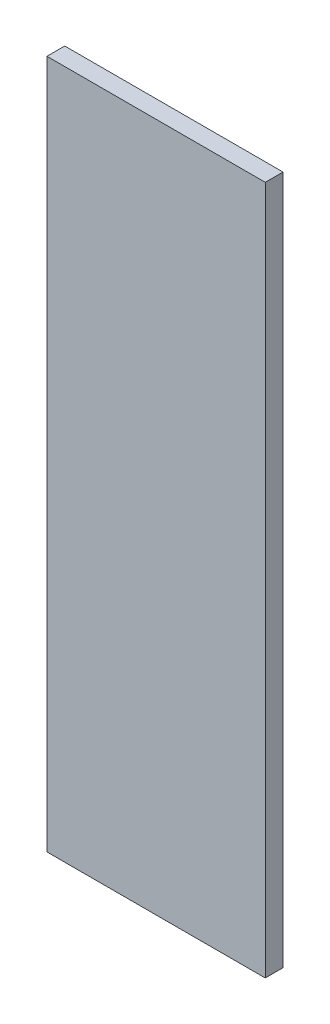
ISO-10303-21;
HEADER;
FILE_DESCRIPTION(('STEP AP214'),'2;1');
FILE_NAME('part.step','',(''),(''),'','','');
FILE_SCHEMA(('AUTOMOTIVE_DESIGN { 1 0 10303 214 1 1 1 1 }'));
ENDSEC;
DATA;
#1=APPLICATION_CONTEXT('core data for automotive mechanical design processes');
#2=APPLICATION_PROTOCOL_DEFINITION('international standard','automotive_design',2000,#1);
#3=PRODUCT_CONTEXT('',#1,'mechanical');
#4=PRODUCT('Part','Part','',(#3));
#5=PRODUCT_RELATED_PRODUCT_CATEGORY('part','',(#4));
#6=PRODUCT_DEFINITION_FORMATION('','',#4);
#7=PRODUCT_DEFINITION_CONTEXT('part definition',#1,'design');
#8=PRODUCT_DEFINITION('design','',#6,#7);
#9=PRODUCT_DEFINITION_SHAPE('','',#8);
#10=(LENGTH_UNIT() NAMED_UNIT(*) SI_UNIT(.MILLI.,.METRE.));
#11=(NAMED_UNIT(*) PLANE_ANGLE_UNIT() SI_UNIT($,.RADIAN.));
#12=(NAMED_UNIT(*) SI_UNIT($,.STERADIAN.) SOLID_ANGLE_UNIT());
#13=UNCERTAINTY_MEASURE_WITH_UNIT(LENGTH_MEASURE(1.E-05),#10,'distance_accuracy_value','');
#14=(GEOMETRIC_REPRESENTATION_CONTEXT(3) GLOBAL_UNCERTAINTY_ASSIGNED_CONTEXT((#13)) GLOBAL_UNIT_ASSIGNED_CONTEXT((#10,
#11,#12)) REPRESENTATION_CONTEXT('',''));
#15=CARTESIAN_POINT('',(0.,0.,0.));
#16=DIRECTION('',(0.,0.,1.));
#17=DIRECTION('',(1.,0.,0.));
#18=AXIS2_PLACEMENT_3D('',#15,#16,#17);
#19=CARTESIAN_POINT('',(0.67499992,-2.13058502,0.));
#20=DIRECTION('',(-1.,0.,0.));
#21=DIRECTION('',(0.,1.,0.));
#22=AXIS2_PLACEMENT_3D('',#19,#20,#21);
#23=PLANE('',#22);
#24=DIRECTION('',(0.,1.,0.));
#25=VECTOR('',#24,1.);
#26=CARTESIAN_POINT('',(0.67499992,-2.13058502,0.));
#27=LINE('',#26,#25);
#28=CARTESIAN_POINT('',(0.67499992,-2.13058502,0.));
#29=VERTEX_POINT('',#28);
#30=CARTESIAN_POINT('',(0.67499992,2.13058502,0.));
#31=VERTEX_POINT('',#30);
#32=EDGE_CURVE('E11',#29,#31,#27,.T.);
#33=ORIENTED_EDGE('',*,*,#32,.T.);
#34=DIRECTION('',(0.,0.,1.));
#35=VECTOR('',#34,1.);
#36=CARTESIAN_POINT('',(0.67499992,2.13058502,0.));
#37=LINE('',#36,#35);
#38=CARTESIAN_POINT('',(0.67499992,2.13058502,0.10999978));
#39=VERTEX_POINT('',#38);
#40=EDGE_CURVE('E24',#31,#39,#37,.T.);
#41=ORIENTED_EDGE('',*,*,#40,.T.);
#42=DIRECTION('',(0.,1.,0.));
#43=VECTOR('',#42,1.);
#44=CARTESIAN_POINT('',(0.67499992,-2.13058502,0.10999978));
#45=LINE('',#44,#43);
#46=CARTESIAN_POINT('',(0.67499992,-2.13058502,0.10999978));
#47=VERTEX_POINT('',#46);
#48=EDGE_CURVE('E87',#47,#39,#45,.T.);
#49=ORIENTED_EDGE('',*,*,#48,.F.);
#50=DIRECTION('',(0.,0.,1.));
#51=VECTOR('',#50,1.);
#52=CARTESIAN_POINT('',(0.67499992,-2.13058502,0.));
#53=LINE('',#52,#51);
#54=EDGE_CURVE('E36',#29,#47,#53,.T.);
#55=ORIENTED_EDGE('',*,*,#54,.F.);
#56=EDGE_LOOP('',(#33,#41,#49,#55));
#57=FACE_BOUND('',#56,.T.);
#58=ADVANCED_FACE('F17',(#57),#23,.F.);
#59=CARTESIAN_POINT('',(0.67499992,2.13058502,0.));
#60=DIRECTION('',(0.,-1.,0.));
#61=DIRECTION('',(-1.,0.,0.));
#62=AXIS2_PLACEMENT_3D('',#59,#60,#61);
#63=PLANE('',#62);
#64=DIRECTION('',(-1.,0.,0.));
#65=VECTOR('',#64,1.);
#66=CARTESIAN_POINT('',(0.67499992,2.13058502,0.));
#67=LINE('',#66,#65);
#68=CARTESIAN_POINT('',(-0.67499992,2.13058502,0.));
#69=VERTEX_POINT('',#68);
#70=EDGE_CURVE('E84',#31,#69,#67,.T.);
#71=ORIENTED_EDGE('',*,*,#70,.T.);
#72=DIRECTION('',(0.,0.,1.));
#73=VECTOR('',#72,1.);
#74=CARTESIAN_POINT('',(-0.67499992,2.13058502,0.));
#75=LINE('',#74,#73);
#76=CARTESIAN_POINT('',(-0.67499992,2.13058502,0.10999978));
#77=VERTEX_POINT('',#76);
#78=EDGE_CURVE('E82',#69,#77,#75,.T.);
#79=ORIENTED_EDGE('',*,*,#78,.T.);
#80=DIRECTION('',(-1.,0.,0.));
#81=VECTOR('',#80,1.);
#82=CARTESIAN_POINT('',(0.67499992,2.13058502,0.10999978));
#83=LINE('',#82,#81);
#84=EDGE_CURVE('E62',#39,#77,#83,.T.);
#85=ORIENTED_EDGE('',*,*,#84,.F.);
#86=ORIENTED_EDGE('',*,*,#40,.F.);
#87=EDGE_LOOP('',(#71,#79,#85,#86));
#88=FACE_BOUND('',#87,.T.);
#89=ADVANCED_FACE('F89',(#88),#63,.F.);
#90=CARTESIAN_POINT('',(-0.67499992,2.13058502,0.));
#91=DIRECTION('',(1.,0.,0.));
#92=DIRECTION('',(0.,-1.,0.));
#93=AXIS2_PLACEMENT_3D('',#90,#91,#92);
#94=PLANE('',#93);
#95=DIRECTION('',(0.,-1.,0.));
#96=VECTOR('',#95,1.);
#97=CARTESIAN_POINT('',(-0.67499992,2.13058502,0.));
#98=LINE('',#97,#96);
#99=CARTESIAN_POINT('',(-0.67499992,-2.13058502,0.));
#100=VERTEX_POINT('',#99);
#101=EDGE_CURVE('E71',#69,#100,#98,.T.);
#102=ORIENTED_EDGE('',*,*,#101,.T.);
#103=DIRECTION('',(0.,0.,1.));
#104=VECTOR('',#103,1.);
#105=CARTESIAN_POINT('',(-0.67499992,-2.13058502,0.));
#106=LINE('',#105,#104);
#107=CARTESIAN_POINT('',(-0.67499992,-2.13058502,0.10999978));
#108=VERTEX_POINT('',#107);
#109=EDGE_CURVE('E65',#100,#108,#106,.T.);
#110=ORIENTED_EDGE('',*,*,#109,.T.);
#111=DIRECTION('',(0.,-1.,0.));
#112=VECTOR('',#111,1.);
#113=CARTESIAN_POINT('',(-0.67499992,2.13058502,0.10999978));
#114=LINE('',#113,#112);
#115=EDGE_CURVE('E57',#77,#108,#114,.T.);
#116=ORIENTED_EDGE('',*,*,#115,.F.);
#117=ORIENTED_EDGE('',*,*,#78,.F.);
#118=EDGE_LOOP('',(#102,#110,#116,#117));
#119=FACE_BOUND('',#118,.T.);
#120=ADVANCED_FACE('F69',(#119),#94,.F.);
#121=CARTESIAN_POINT('',(-0.67499992,-2.13058502,0.));
#122=DIRECTION('',(0.,1.,0.));
#123=DIRECTION('',(1.,0.,0.));
#124=AXIS2_PLACEMENT_3D('',#121,#122,#123);
#125=PLANE('',#124);
#126=DIRECTION('',(1.,0.,0.));
#127=VECTOR('',#126,1.);
#128=CARTESIAN_POINT('',(-0.67499992,-2.13058502,0.));
#129=LINE('',#128,#127);
#130=EDGE_CURVE('E66',#100,#29,#129,.T.);
#131=ORIENTED_EDGE('',*,*,#130,.T.);
#132=ORIENTED_EDGE('',*,*,#54,.T.);
#133=DIRECTION('',(1.,0.,0.));
#134=VECTOR('',#133,1.);
#135=CARTESIAN_POINT('',(-0.67499992,-2.13058502,0.10999978));
#136=LINE('',#135,#134);
#137=EDGE_CURVE('E61',#108,#47,#136,.T.);
#138=ORIENTED_EDGE('',*,*,#137,.F.);
#139=ORIENTED_EDGE('',*,*,#109,.F.);
#140=EDGE_LOOP('',(#131,#132,#138,#139));
#141=FACE_BOUND('',#140,.T.);
#142=ADVANCED_FACE('F76',(#141),#125,.F.);
#143=CARTESIAN_POINT('',(0.,0.,0.));
#144=DIRECTION('',(0.,0.,1.));
#145=DIRECTION('',(1.,0.,0.));
#146=AXIS2_PLACEMENT_3D('',#143,#144,#145);
#147=PLANE('',#146);
#148=ORIENTED_EDGE('',*,*,#130,.F.);
#149=ORIENTED_EDGE('',*,*,#101,.F.);
#150=ORIENTED_EDGE('',*,*,#70,.F.);
#151=ORIENTED_EDGE('',*,*,#32,.F.);
#152=EDGE_LOOP('',(#148,#149,#150,#151));
#153=FACE_BOUND('',#152,.T.);
#154=ADVANCED_FACE('F91',(#153),#147,.F.);
#155=CARTESIAN_POINT('',(0.,0.,0.10999978));
#156=DIRECTION('',(0.,0.,1.));
#157=DIRECTION('',(1.,0.,0.));
#158=AXIS2_PLACEMENT_3D('',#155,#156,#157);
#159=PLANE('',#158);
#160=ORIENTED_EDGE('',*,*,#48,.T.);
#161=ORIENTED_EDGE('',*,*,#84,.T.);
#162=ORIENTED_EDGE('',*,*,#115,.T.);
#163=ORIENTED_EDGE('',*,*,#137,.T.);
#164=EDGE_LOOP('',(#160,#161,#162,#163));
#165=FACE_BOUND('',#164,.T.);
#166=ADVANCED_FACE('F59',(#165),#159,.T.);
#167=CLOSED_SHELL('',(#58,#89,#120,#142,#154,#166));
#168=MANIFOLD_SOLID_BREP('B1',#167);
#169=ADVANCED_BREP_SHAPE_REPRESENTATION('',(#18,#168),#14);
#170=SHAPE_DEFINITION_REPRESENTATION(#9,#169);
ENDSEC;
END-ISO-10303-21;
